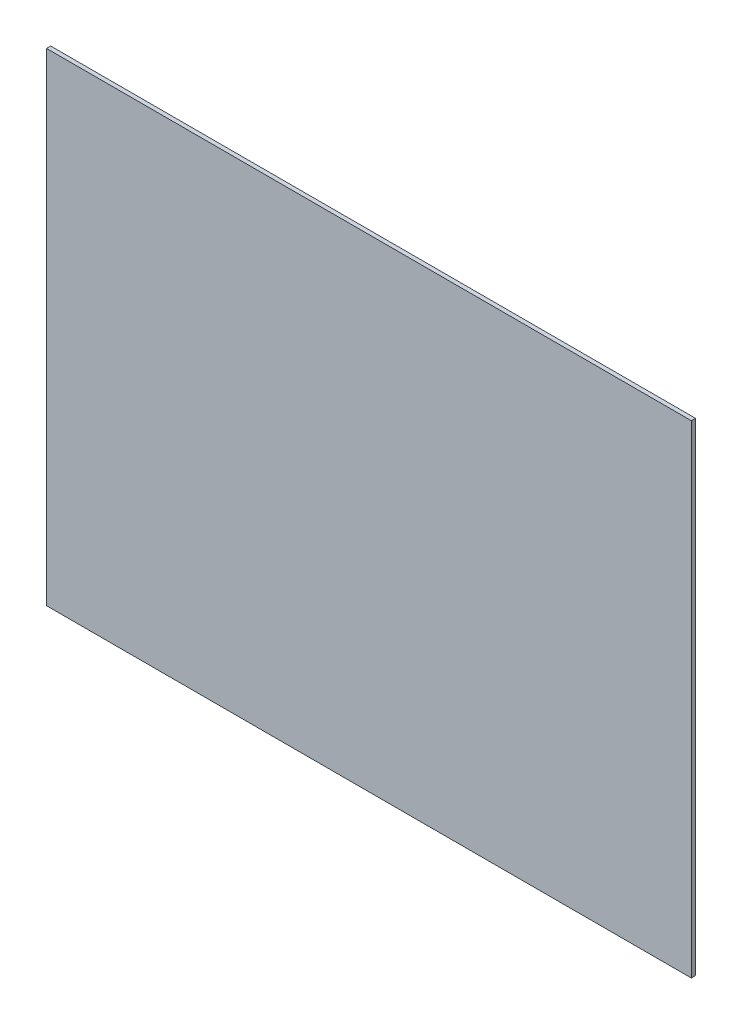
ISO-10303-21;
HEADER;
FILE_DESCRIPTION(('STEP AP214'),'2;1');
FILE_NAME('part.step','',(''),(''),'','','');
FILE_SCHEMA(('AUTOMOTIVE_DESIGN { 1 0 10303 214 1 1 1 1 }'));
ENDSEC;
DATA;
#1=APPLICATION_CONTEXT('core data for automotive mechanical design processes');
#2=APPLICATION_PROTOCOL_DEFINITION('international standard','automotive_design',2000,#1);
#3=PRODUCT_CONTEXT('',#1,'mechanical');
#4=PRODUCT('Part','Part','',(#3));
#5=PRODUCT_RELATED_PRODUCT_CATEGORY('part','',(#4));
#6=PRODUCT_DEFINITION_FORMATION('','',#4);
#7=PRODUCT_DEFINITION_CONTEXT('part definition',#1,'design');
#8=PRODUCT_DEFINITION('design','',#6,#7);
#9=PRODUCT_DEFINITION_SHAPE('','',#8);
#10=(LENGTH_UNIT() NAMED_UNIT(*) SI_UNIT(.MILLI.,.METRE.));
#11=(NAMED_UNIT(*) PLANE_ANGLE_UNIT() SI_UNIT($,.RADIAN.));
#12=(NAMED_UNIT(*) SI_UNIT($,.STERADIAN.) SOLID_ANGLE_UNIT());
#13=UNCERTAINTY_MEASURE_WITH_UNIT(LENGTH_MEASURE(1.E-05),#10,'distance_accuracy_value','');
#14=(GEOMETRIC_REPRESENTATION_CONTEXT(3) GLOBAL_UNCERTAINTY_ASSIGNED_CONTEXT((#13)) GLOBAL_UNIT_ASSIGNED_CONTEXT((#10,
#11,#12)) REPRESENTATION_CONTEXT('',''));
#15=CARTESIAN_POINT('',(0.,0.,0.));
#16=DIRECTION('',(0.,0.,1.));
#17=DIRECTION('',(1.,0.,0.));
#18=AXIS2_PLACEMENT_3D('',#15,#16,#17);
#19=CARTESIAN_POINT('',(165.71,124.04,2.14));
#20=DIRECTION('',(-1.,0.,0.));
#21=DIRECTION('',(0.,-1.,0.));
#22=AXIS2_PLACEMENT_3D('',#19,#20,#21);
#23=PLANE('',#22);
#24=DIRECTION('',(0.,1.,0.));
#25=VECTOR('',#24,1.);
#26=CARTESIAN_POINT('',(165.71,124.04,0.));
#27=LINE('',#26,#25);
#28=CARTESIAN_POINT('',(165.71,-124.04,0.));
#29=VERTEX_POINT('',#28);
#30=CARTESIAN_POINT('',(165.71,124.04,0.));
#31=VERTEX_POINT('',#30);
#32=EDGE_CURVE('E101',#29,#31,#27,.T.);
#33=ORIENTED_EDGE('',*,*,#32,.T.);
#34=DIRECTION('',(0.,0.,-1.));
#35=VECTOR('',#34,1.);
#36=CARTESIAN_POINT('',(165.71,124.04,2.14));
#37=LINE('',#36,#35);
#38=CARTESIAN_POINT('',(165.71,124.04,2.14));
#39=VERTEX_POINT('',#38);
#40=EDGE_CURVE('E11',#39,#31,#37,.T.);
#41=ORIENTED_EDGE('',*,*,#40,.F.);
#42=DIRECTION('',(0.,1.,0.));
#43=VECTOR('',#42,1.);
#44=CARTESIAN_POINT('',(165.71,124.04,2.14));
#45=LINE('',#44,#43);
#46=CARTESIAN_POINT('',(165.71,-124.04,2.14));
#47=VERTEX_POINT('',#46);
#48=EDGE_CURVE('E89',#47,#39,#45,.T.);
#49=ORIENTED_EDGE('',*,*,#48,.F.);
#50=DIRECTION('',(0.,0.,-1.));
#51=VECTOR('',#50,1.);
#52=CARTESIAN_POINT('',(165.71,-124.04,2.14));
#53=LINE('',#52,#51);
#54=EDGE_CURVE('E97',#47,#29,#53,.T.);
#55=ORIENTED_EDGE('',*,*,#54,.T.);
#56=EDGE_LOOP('',(#33,#41,#49,#55));
#57=FACE_BOUND('',#56,.T.);
#58=ADVANCED_FACE('F38',(#57),#23,.F.);
#59=CARTESIAN_POINT('',(-165.71,124.04,2.14));
#60=DIRECTION('',(0.,-1.,0.));
#61=DIRECTION('',(0.,0.,-1.));
#62=AXIS2_PLACEMENT_3D('',#59,#60,#61);
#63=PLANE('',#62);
#64=DIRECTION('',(-1.,0.,0.));
#65=VECTOR('',#64,1.);
#66=CARTESIAN_POINT('',(-165.71,124.04,0.));
#67=LINE('',#66,#65);
#68=CARTESIAN_POINT('',(-165.71,124.04,0.));
#69=VERTEX_POINT('',#68);
#70=EDGE_CURVE('E93',#31,#69,#67,.T.);
#71=ORIENTED_EDGE('',*,*,#70,.T.);
#72=DIRECTION('',(0.,0.,-1.));
#73=VECTOR('',#72,1.);
#74=CARTESIAN_POINT('',(-165.71,124.04,2.14));
#75=LINE('',#74,#73);
#76=CARTESIAN_POINT('',(-165.71,124.04,2.14));
#77=VERTEX_POINT('',#76);
#78=EDGE_CURVE('E46',#77,#69,#75,.T.);
#79=ORIENTED_EDGE('',*,*,#78,.F.);
#80=DIRECTION('',(-1.,0.,0.));
#81=VECTOR('',#80,1.);
#82=CARTESIAN_POINT('',(-165.71,124.04,2.14));
#83=LINE('',#82,#81);
#84=EDGE_CURVE('E84',#39,#77,#83,.T.);
#85=ORIENTED_EDGE('',*,*,#84,.F.);
#86=ORIENTED_EDGE('',*,*,#40,.T.);
#87=EDGE_LOOP('',(#71,#79,#85,#86));
#88=FACE_BOUND('',#87,.T.);
#89=ADVANCED_FACE('F92',(#88),#63,.F.);
#90=CARTESIAN_POINT('',(-165.71,124.04,2.14));
#91=DIRECTION('',(1.,0.,0.));
#92=DIRECTION('',(0.,1.,0.));
#93=AXIS2_PLACEMENT_3D('',#90,#91,#92);
#94=PLANE('',#93);
#95=DIRECTION('',(0.,-1.,0.));
#96=VECTOR('',#95,1.);
#97=CARTESIAN_POINT('',(-165.71,124.04,0.));
#98=LINE('',#97,#96);
#99=CARTESIAN_POINT('',(-165.71,-124.04,0.));
#100=VERTEX_POINT('',#99);
#101=EDGE_CURVE('E71',#69,#100,#98,.T.);
#102=ORIENTED_EDGE('',*,*,#101,.T.);
#103=DIRECTION('',(0.,0.,-1.));
#104=VECTOR('',#103,1.);
#105=CARTESIAN_POINT('',(-165.71,-124.04,2.14));
#106=LINE('',#105,#104);
#107=CARTESIAN_POINT('',(-165.71,-124.04,2.14));
#108=VERTEX_POINT('',#107);
#109=EDGE_CURVE('E94',#108,#100,#106,.T.);
#110=ORIENTED_EDGE('',*,*,#109,.F.);
#111=DIRECTION('',(0.,-1.,0.));
#112=VECTOR('',#111,1.);
#113=CARTESIAN_POINT('',(-165.71,124.04,2.14));
#114=LINE('',#113,#112);
#115=EDGE_CURVE('E87',#77,#108,#114,.T.);
#116=ORIENTED_EDGE('',*,*,#115,.F.);
#117=ORIENTED_EDGE('',*,*,#78,.T.);
#118=EDGE_LOOP('',(#102,#110,#116,#117));
#119=FACE_BOUND('',#118,.T.);
#120=ADVANCED_FACE('F95',(#119),#94,.F.);
#121=CARTESIAN_POINT('',(-165.71,-124.04,2.14));
#122=DIRECTION('',(0.,1.,0.));
#123=DIRECTION('',(0.,0.,1.));
#124=AXIS2_PLACEMENT_3D('',#121,#122,#123);
#125=PLANE('',#124);
#126=DIRECTION('',(1.,0.,0.));
#127=VECTOR('',#126,1.);
#128=CARTESIAN_POINT('',(-165.71,-124.04,0.));
#129=LINE('',#128,#127);
#130=EDGE_CURVE('E77',#100,#29,#129,.T.);
#131=ORIENTED_EDGE('',*,*,#130,.T.);
#132=ORIENTED_EDGE('',*,*,#54,.F.);
#133=DIRECTION('',(1.,0.,0.));
#134=VECTOR('',#133,1.);
#135=CARTESIAN_POINT('',(-165.71,-124.04,2.14));
#136=LINE('',#135,#134);
#137=EDGE_CURVE('E54',#108,#47,#136,.T.);
#138=ORIENTED_EDGE('',*,*,#137,.F.);
#139=ORIENTED_EDGE('',*,*,#109,.T.);
#140=EDGE_LOOP('',(#131,#132,#138,#139));
#141=FACE_BOUND('',#140,.T.);
#142=ADVANCED_FACE('F108',(#141),#125,.F.);
#143=CARTESIAN_POINT('',(0.,0.,2.14));
#144=DIRECTION('',(0.,0.,1.));
#145=DIRECTION('',(1.,0.,0.));
#146=AXIS2_PLACEMENT_3D('',#143,#144,#145);
#147=PLANE('',#146);
#148=ORIENTED_EDGE('',*,*,#48,.T.);
#149=ORIENTED_EDGE('',*,*,#84,.T.);
#150=ORIENTED_EDGE('',*,*,#115,.T.);
#151=ORIENTED_EDGE('',*,*,#137,.T.);
#152=EDGE_LOOP('',(#148,#149,#150,#151));
#153=FACE_BOUND('',#152,.T.);
#154=ADVANCED_FACE('F85',(#153),#147,.T.);
#155=CARTESIAN_POINT('',(0.,0.,0.));
#156=DIRECTION('',(0.,0.,1.));
#157=DIRECTION('',(1.,0.,0.));
#158=AXIS2_PLACEMENT_3D('',#155,#156,#157);
#159=PLANE('',#158);
#160=ORIENTED_EDGE('',*,*,#32,.F.);
#161=ORIENTED_EDGE('',*,*,#130,.F.);
#162=ORIENTED_EDGE('',*,*,#101,.F.);
#163=ORIENTED_EDGE('',*,*,#70,.F.);
#164=EDGE_LOOP('',(#160,#161,#162,#163));
#165=FACE_BOUND('',#164,.T.);
#166=ADVANCED_FACE('F111',(#165),#159,.F.);
#167=CLOSED_SHELL('',(#58,#89,#120,#142,#154,#166));
#168=MANIFOLD_SOLID_BREP('B2',#167);
#169=ADVANCED_BREP_SHAPE_REPRESENTATION('',(#18,#168),#14);
#170=SHAPE_DEFINITION_REPRESENTATION(#9,#169);
ENDSEC;
END-ISO-10303-21;
